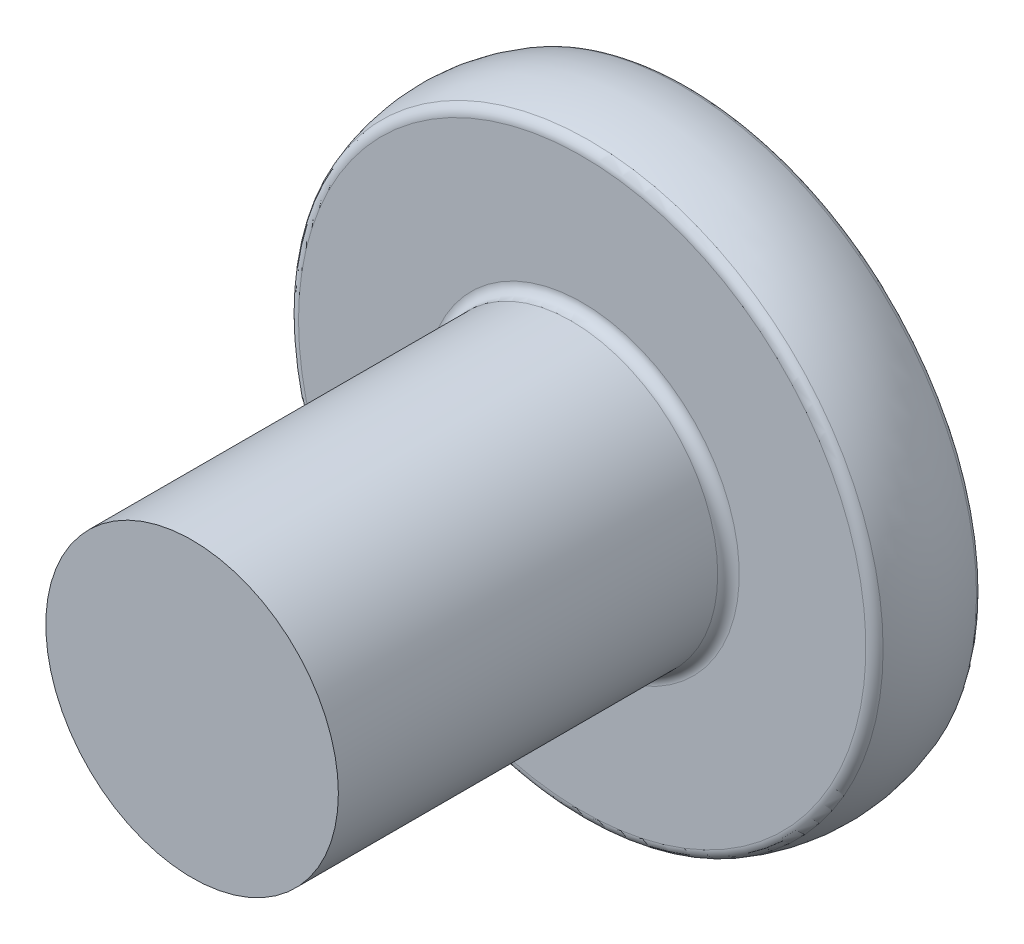
ISO-10303-21;
HEADER;
FILE_DESCRIPTION(('STEP AP214'),'2;1');
FILE_NAME('part.step','',(''),(''),'','','');
FILE_SCHEMA(('AUTOMOTIVE_DESIGN { 1 0 10303 214 1 1 1 1 }'));
ENDSEC;
DATA;
#1=APPLICATION_CONTEXT('core data for automotive mechanical design processes');
#2=APPLICATION_PROTOCOL_DEFINITION('international standard','automotive_design',2000,#1);
#3=PRODUCT_CONTEXT('',#1,'mechanical');
#4=PRODUCT('Part','Part','',(#3));
#5=PRODUCT_RELATED_PRODUCT_CATEGORY('part','',(#4));
#6=PRODUCT_DEFINITION_FORMATION('','',#4);
#7=PRODUCT_DEFINITION_CONTEXT('part definition',#1,'design');
#8=PRODUCT_DEFINITION('design','',#6,#7);
#9=PRODUCT_DEFINITION_SHAPE('','',#8);
#10=(LENGTH_UNIT() NAMED_UNIT(*) SI_UNIT(.MILLI.,.METRE.));
#11=(NAMED_UNIT(*) PLANE_ANGLE_UNIT() SI_UNIT($,.RADIAN.));
#12=(NAMED_UNIT(*) SI_UNIT($,.STERADIAN.) SOLID_ANGLE_UNIT());
#13=UNCERTAINTY_MEASURE_WITH_UNIT(LENGTH_MEASURE(1.E-05),#10,'distance_accuracy_value','');
#14=(GEOMETRIC_REPRESENTATION_CONTEXT(3) GLOBAL_UNCERTAINTY_ASSIGNED_CONTEXT((#13)) GLOBAL_UNIT_ASSIGNED_CONTEXT((#10,
#11,#12)) REPRESENTATION_CONTEXT('',''));
#15=CARTESIAN_POINT('',(0.,0.,0.));
#16=DIRECTION('',(0.,0.,1.));
#17=DIRECTION('',(1.,0.,0.));
#18=AXIS2_PLACEMENT_3D('',#15,#16,#17);
#19=CARTESIAN_POINT('',(0.,0.,-1.57734));
#20=DIRECTION('',(0.,0.,1.));
#21=DIRECTION('',(1.,0.,0.));
#22=AXIS2_PLACEMENT_3D('',#19,#20,#21);
#23=TOROIDAL_SURFACE('',#22,4.61751026070632,0.17526);
#24=CARTESIAN_POINT('',(0.,0.,-1.7526));
#25=DIRECTION('',(0.,0.,-1.));
#26=DIRECTION('',(1.,0.,0.));
#27=AXIS2_PLACEMENT_3D('',#24,#25,#26);
#28=CIRCLE('',#27,4.61751026070632);
#29=CARTESIAN_POINT('',(4.61751026070632,0.,-1.7526));
#30=VERTEX_POINT('',#29);
#31=EDGE_CURVE('E80',#30,#30,#28,.T.);
#32=ORIENTED_EDGE('',*,*,#31,.F.);
#33=EDGE_LOOP('',(#32));
#34=FACE_BOUND('',#33,.T.);
#35=CARTESIAN_POINT('',(0.,0.,-1.63660614798932));
#36=DIRECTION('',(0.,0.,1.));
#37=DIRECTION('',(1.,0.,0.));
#38=AXIS2_PLACEMENT_3D('',#35,#36,#37);
#39=CIRCLE('',#38,4.78244537310665);
#40=CARTESIAN_POINT('',(4.78244537310665,0.,-1.63660614798932));
#41=VERTEX_POINT('',#40);
#42=EDGE_CURVE('E25',#41,#41,#39,.T.);
#43=ORIENTED_EDGE('',*,*,#42,.F.);
#44=EDGE_LOOP('',(#43));
#45=FACE_BOUND('',#44,.T.);
#46=ADVANCED_FACE('F17',(#34,#45),#23,.T.);
#47=CARTESIAN_POINT('',(0.,0.,-0.17526));
#48=DIRECTION('',(0.,0.,-1.));
#49=DIRECTION('',(-1.,0.,0.));
#50=AXIS2_PLACEMENT_3D('',#47,#48,#49);
#51=TOROIDAL_SURFACE('',#50,4.61751026070632,0.17526);
#52=CARTESIAN_POINT('',(0.,0.,-0.115993852010678));
#53=DIRECTION('',(0.,0.,-1.));
#54=DIRECTION('',(-1.,0.,0.));
#55=AXIS2_PLACEMENT_3D('',#52,#53,#54);
#56=CIRCLE('',#55,4.78244537310665);
#57=CARTESIAN_POINT('',(-4.78244537310665,0.,-0.115993852010678));
#58=VERTEX_POINT('',#57);
#59=EDGE_CURVE('E11',#58,#58,#56,.T.);
#60=ORIENTED_EDGE('',*,*,#59,.F.);
#61=EDGE_LOOP('',(#60));
#62=FACE_BOUND('',#61,.T.);
#63=CARTESIAN_POINT('',(0.,0.,0.));
#64=DIRECTION('',(0.,0.,1.));
#65=DIRECTION('',(-1.,0.,0.));
#66=AXIS2_PLACEMENT_3D('',#63,#64,#65);
#67=CIRCLE('',#66,4.61751026070632);
#68=CARTESIAN_POINT('',(-4.61751026070632,0.,0.));
#69=VERTEX_POINT('',#68);
#70=EDGE_CURVE('E63',#69,#69,#67,.T.);
#71=ORIENTED_EDGE('',*,*,#70,.F.);
#72=EDGE_LOOP('',(#71));
#73=FACE_BOUND('',#72,.T.);
#74=ADVANCED_FACE('F167',(#62,#73),#51,.T.);
#75=CARTESIAN_POINT('',(0.,0.,0.17526));
#76=DIRECTION('',(0.,0.,-1.));
#77=DIRECTION('',(-1.,0.,0.));
#78=AXIS2_PLACEMENT_3D('',#75,#76,#77);
#79=TOROIDAL_SURFACE('',#78,2.55651,0.17526);
#80=CARTESIAN_POINT('',(0.,0.,0.));
#81=DIRECTION('',(0.,0.,-1.));
#82=DIRECTION('',(-1.,0.,0.));
#83=AXIS2_PLACEMENT_3D('',#80,#81,#82);
#84=CIRCLE('',#83,2.55651);
#85=CARTESIAN_POINT('',(-2.55651,0.,0.));
#86=VERTEX_POINT('',#85);
#87=EDGE_CURVE('E67',#86,#86,#84,.T.);
#88=ORIENTED_EDGE('',*,*,#87,.F.);
#89=EDGE_LOOP('',(#88));
#90=FACE_BOUND('',#89,.T.);
#91=CARTESIAN_POINT('',(0.,0.,0.17526));
#92=DIRECTION('',(0.,0.,1.));
#93=DIRECTION('',(-1.,0.,0.));
#94=AXIS2_PLACEMENT_3D('',#91,#92,#93);
#95=CIRCLE('',#94,2.38125);
#96=CARTESIAN_POINT('',(-2.38125,0.,0.17526));
#97=VERTEX_POINT('',#96);
#98=EDGE_CURVE('E68',#97,#97,#95,.T.);
#99=ORIENTED_EDGE('',*,*,#98,.F.);
#100=EDGE_LOOP('',(#99));
#101=FACE_BOUND('',#100,.T.);
#102=ADVANCED_FACE('F148',(#90,#101),#79,.F.);
#103=CARTESIAN_POINT('',(0.,0.,-0.8763));
#104=DIRECTION('',(0.,0.,1.));
#105=DIRECTION('',(1.,0.,0.));
#106=AXIS2_PLACEMENT_3D('',#103,#104,#105);
#107=TOROIDAL_SURFACE('',#106,2.66654642857142,2.24835357142858);
#108=ORIENTED_EDGE('',*,*,#59,.T.);
#109=EDGE_LOOP('',(#108));
#110=FACE_BOUND('',#109,.T.);
#111=ORIENTED_EDGE('',*,*,#42,.T.);
#112=EDGE_LOOP('',(#111));
#113=FACE_BOUND('',#112,.T.);
#114=ADVANCED_FACE('F143',(#110,#113),#107,.T.);
#115=CARTESIAN_POINT('',(0.,2.38125,0.));
#116=DIRECTION('',(0.,0.,-1.));
#117=DIRECTION('',(0.,-1.,0.));
#118=AXIS2_PLACEMENT_3D('',#115,#116,#117);
#119=PLANE('',#118);
#120=ORIENTED_EDGE('',*,*,#87,.T.);
#121=EDGE_LOOP('',(#120));
#122=FACE_BOUND('',#121,.T.);
#123=ORIENTED_EDGE('',*,*,#70,.T.);
#124=EDGE_LOOP('',(#123));
#125=FACE_BOUND('',#124,.T.);
#126=ADVANCED_FACE('F64',(#122,#125),#119,.F.);
#127=CARTESIAN_POINT('',(0.,0.,6.35));
#128=DIRECTION('',(0.,0.,1.));
#129=DIRECTION('',(1.,0.,0.));
#130=AXIS2_PLACEMENT_3D('',#127,#128,#129);
#131=CYLINDRICAL_SURFACE('',#130,2.38125);
#132=ORIENTED_EDGE('',*,*,#98,.T.);
#133=EDGE_LOOP('',(#132));
#134=FACE_BOUND('',#133,.T.);
#135=CARTESIAN_POINT('',(0.,0.,6.35));
#136=DIRECTION('',(0.,0.,1.));
#137=DIRECTION('',(1.,0.,0.));
#138=AXIS2_PLACEMENT_3D('',#135,#136,#137);
#139=CIRCLE('',#138,2.38125);
#140=CARTESIAN_POINT('',(2.38125,0.,6.35));
#141=VERTEX_POINT('',#140);
#142=EDGE_CURVE('E75',#141,#141,#139,.T.);
#143=ORIENTED_EDGE('',*,*,#142,.F.);
#144=EDGE_LOOP('',(#143));
#145=FACE_BOUND('',#144,.T.);
#146=ADVANCED_FACE('F125',(#134,#145),#131,.T.);
#147=CARTESIAN_POINT('',(0.,2.38125,6.35));
#148=DIRECTION('',(0.,0.,-1.));
#149=DIRECTION('',(0.,-1.,0.));
#150=AXIS2_PLACEMENT_3D('',#147,#148,#149);
#151=PLANE('',#150);
#152=ORIENTED_EDGE('',*,*,#142,.T.);
#153=EDGE_LOOP('',(#152));
#154=FACE_BOUND('',#153,.T.);
#155=ADVANCED_FACE('F114',(#154),#151,.F.);
#156=CARTESIAN_POINT('',(0.,0.,-1.7526));
#157=DIRECTION('',(0.,0.,1.));
#158=DIRECTION('',(1.,0.,0.));
#159=AXIS2_PLACEMENT_3D('',#156,#157,#158);
#160=PLANE('',#159);
#161=ORIENTED_EDGE('',*,*,#31,.T.);
#162=EDGE_LOOP('',(#161));
#163=FACE_BOUND('',#162,.T.);
#164=ADVANCED_FACE('F110',(#163),#160,.F.);
#165=CLOSED_SHELL('',(#46,#74,#102,#114,#126,#146,#155,#164));
#166=MANIFOLD_SOLID_BREP('B1',#165);
#167=ADVANCED_BREP_SHAPE_REPRESENTATION('',(#18,#166),#14);
#168=SHAPE_DEFINITION_REPRESENTATION(#9,#167);
ENDSEC;
END-ISO-10303-21;
